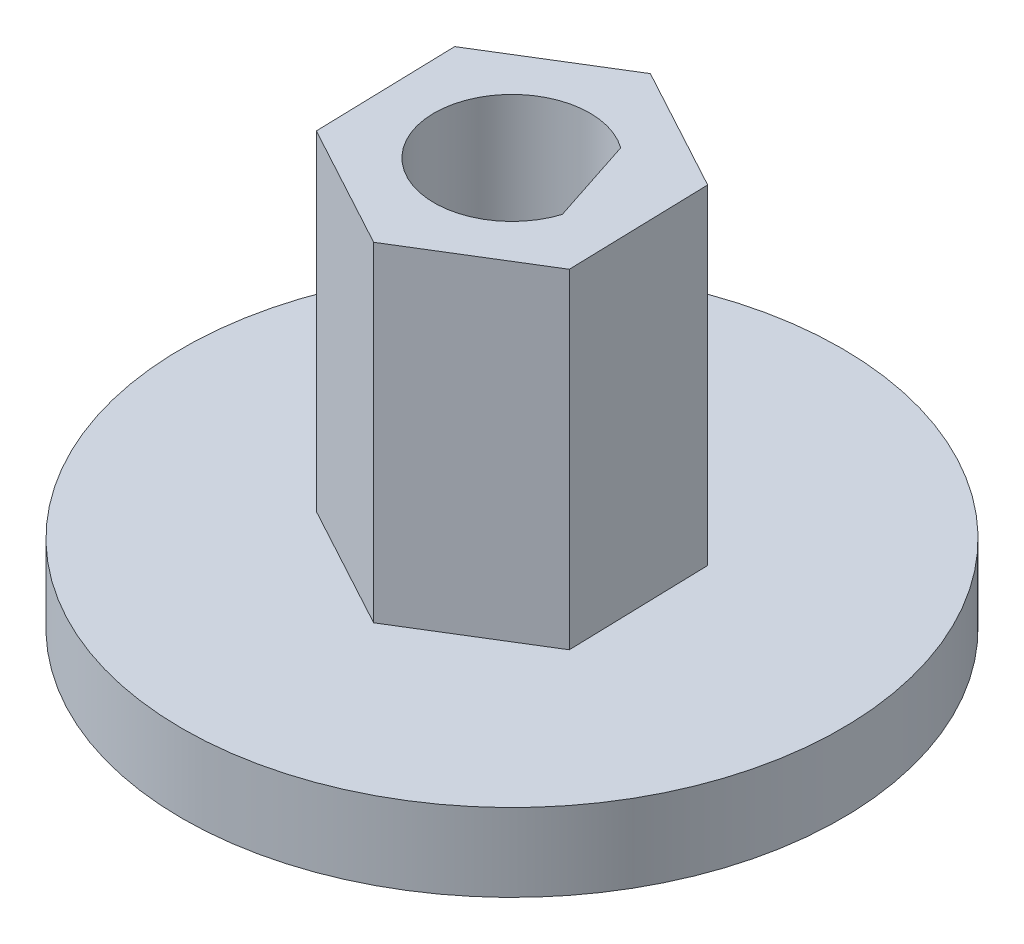
ISO-10303-21;
HEADER;
FILE_DESCRIPTION(('STEP AP214'),'2;1');
FILE_NAME('part.step','',(''),(''),'','','');
FILE_SCHEMA(('AUTOMOTIVE_DESIGN { 1 0 10303 214 1 1 1 1 }'));
ENDSEC;
DATA;
#1=APPLICATION_CONTEXT('core data for automotive mechanical design processes');
#2=APPLICATION_PROTOCOL_DEFINITION('international standard','automotive_design',2000,#1);
#3=PRODUCT_CONTEXT('',#1,'mechanical');
#4=PRODUCT('Part','Part','',(#3));
#5=PRODUCT_RELATED_PRODUCT_CATEGORY('part','',(#4));
#6=PRODUCT_DEFINITION_FORMATION('','',#4);
#7=PRODUCT_DEFINITION_CONTEXT('part definition',#1,'design');
#8=PRODUCT_DEFINITION('design','',#6,#7);
#9=PRODUCT_DEFINITION_SHAPE('','',#8);
#10=(LENGTH_UNIT() NAMED_UNIT(*) SI_UNIT(.MILLI.,.METRE.));
#11=(NAMED_UNIT(*) PLANE_ANGLE_UNIT() SI_UNIT($,.RADIAN.));
#12=(NAMED_UNIT(*) SI_UNIT($,.STERADIAN.) SOLID_ANGLE_UNIT());
#13=UNCERTAINTY_MEASURE_WITH_UNIT(LENGTH_MEASURE(1.E-05),#10,'distance_accuracy_value','');
#14=(GEOMETRIC_REPRESENTATION_CONTEXT(3) GLOBAL_UNCERTAINTY_ASSIGNED_CONTEXT((#13)) GLOBAL_UNIT_ASSIGNED_CONTEXT((#10,
#11,#12)) REPRESENTATION_CONTEXT('',''));
#15=CARTESIAN_POINT('',(0.,0.,0.));
#16=DIRECTION('',(0.,0.,1.));
#17=DIRECTION('',(1.,0.,0.));
#18=AXIS2_PLACEMENT_3D('',#15,#16,#17);
#19=CARTESIAN_POINT('',(0.,0.,0.));
#20=DIRECTION('',(0.,1.,0.));
#21=DIRECTION('',(0.,0.,1.));
#22=AXIS2_PLACEMENT_3D('',#19,#20,#21);
#23=PLANE('',#22);
#24=CARTESIAN_POINT('',(0.,0.,0.));
#25=DIRECTION('',(0.,1.,0.));
#26=DIRECTION('',(0.,0.,1.));
#27=AXIS2_PLACEMENT_3D('',#24,#25,#26);
#28=CIRCLE('',#27,12.7);
#29=CARTESIAN_POINT('',(0.,0.,12.7));
#30=VERTEX_POINT('',#29);
#31=EDGE_CURVE('E37',#30,#30,#28,.T.);
#32=ORIENTED_EDGE('',*,*,#31,.F.);
#33=EDGE_LOOP('',(#32));
#34=FACE_BOUND('',#33,.T.);
#35=DIRECTION('',(0.311402298469126,0.,0.950278174277482));
#36=VECTOR('',#35,1.);
#37=CARTESIAN_POINT('',(2.30686637596834,0.,-0.755950742827355));
#38=LINE('',#37,#36);
#39=CARTESIAN_POINT('',(1.75797567842878,0.,-2.43095074282736));
#40=VERTEX_POINT('',#39);
#41=CARTESIAN_POINT('',(2.8557570735079,0.,0.919049257172645));
#42=VERTEX_POINT('',#41);
#43=EDGE_CURVE('E98',#40,#42,#38,.T.);
#44=ORIENTED_EDGE('',*,*,#43,.F.);
#45=CARTESIAN_POINT('',(0.,0.,0.));
#46=DIRECTION('',(0.,1.,0.));
#47=DIRECTION('',(0.,0.,1.));
#48=AXIS2_PLACEMENT_3D('',#45,#46,#47);
#49=CIRCLE('',#48,3.);
#50=EDGE_CURVE('E100',#40,#42,#49,.T.);
#51=ORIENTED_EDGE('',*,*,#50,.T.);
#52=EDGE_LOOP('',(#44,#51));
#53=FACE_BOUND('',#52,.T.);
#54=ADVANCED_FACE('F33',(#34,#53),#23,.F.);
#55=CARTESIAN_POINT('',(0.,15.7,0.));
#56=DIRECTION('',(0.,1.,0.));
#57=DIRECTION('',(0.,0.,1.));
#58=AXIS2_PLACEMENT_3D('',#55,#56,#57);
#59=PLANE('',#58);
#60=DIRECTION('',(0.879285702622515,0.,0.476294712508579));
#61=VECTOR('',#60,1.);
#62=CARTESIAN_POINT('',(-4.67137463720313,15.7,2.86894178717555));
#63=LINE('',#62,#61);
#64=CARTESIAN_POINT('',(-4.67137463720313,15.7,2.86894178717555));
#65=VERTEX_POINT('',#64);
#66=CARTESIAN_POINT('',(0.148889151071191,15.7,5.48));
#67=VERTEX_POINT('',#66);
#68=EDGE_CURVE('E115',#65,#67,#63,.T.);
#69=ORIENTED_EDGE('',*,*,#68,.T.);
#70=DIRECTION('',(0.852126172031893,0.,-0.523336399401258));
#71=VECTOR('',#70,1.);
#72=CARTESIAN_POINT('',(0.148889151071191,15.7,5.48));
#73=LINE('',#72,#71);
#74=CARTESIAN_POINT('',(4.82026378827432,15.7,2.61105821282444));
#75=VERTEX_POINT('',#74);
#76=EDGE_CURVE('E118',#67,#75,#73,.T.);
#77=ORIENTED_EDGE('',*,*,#76,.T.);
#78=DIRECTION('',(-0.0271595305906223,0.,-0.999631111909837));
#79=VECTOR('',#78,1.);
#80=CARTESIAN_POINT('',(4.82026378827432,15.7,2.61105821282444));
#81=LINE('',#80,#79);
#82=CARTESIAN_POINT('',(4.67137463720313,15.7,-2.86894178717556));
#83=VERTEX_POINT('',#82);
#84=EDGE_CURVE('E121',#75,#83,#81,.T.);
#85=ORIENTED_EDGE('',*,*,#84,.T.);
#86=DIRECTION('',(-0.879285702622515,0.,-0.476294712508579));
#87=VECTOR('',#86,1.);
#88=CARTESIAN_POINT('',(4.67137463720313,15.7,-2.86894178717556));
#89=LINE('',#88,#87);
#90=CARTESIAN_POINT('',(-0.148889151071195,15.7,-5.48));
#91=VERTEX_POINT('',#90);
#92=EDGE_CURVE('E123',#83,#91,#89,.T.);
#93=ORIENTED_EDGE('',*,*,#92,.T.);
#94=DIRECTION('',(-0.852126172031893,0.,0.523336399401258));
#95=VECTOR('',#94,1.);
#96=CARTESIAN_POINT('',(-0.148889151071195,15.7,-5.48));
#97=LINE('',#96,#95);
#98=CARTESIAN_POINT('',(-4.82026378827432,15.7,-2.61105821282445));
#99=VERTEX_POINT('',#98);
#100=EDGE_CURVE('E125',#91,#99,#97,.T.);
#101=ORIENTED_EDGE('',*,*,#100,.T.);
#102=DIRECTION('',(0.0271595305906223,0.,0.999631111909837));
#103=VECTOR('',#102,1.);
#104=CARTESIAN_POINT('',(-4.82026378827432,15.7,-2.61105821282445));
#105=LINE('',#104,#103);
#106=EDGE_CURVE('E127',#99,#65,#105,.T.);
#107=ORIENTED_EDGE('',*,*,#106,.T.);
#108=EDGE_LOOP('',(#69,#77,#85,#93,#101,#107));
#109=FACE_BOUND('',#108,.T.);
#110=CARTESIAN_POINT('',(0.,15.7,0.));
#111=DIRECTION('',(0.,1.,0.));
#112=DIRECTION('',(0.,0.,1.));
#113=AXIS2_PLACEMENT_3D('',#110,#111,#112);
#114=CIRCLE('',#113,3.);
#115=CARTESIAN_POINT('',(1.75797567842878,15.7,-2.43095074282736));
#116=VERTEX_POINT('',#115);
#117=CARTESIAN_POINT('',(2.8557570735079,15.7,0.919049257172645));
#118=VERTEX_POINT('',#117);
#119=EDGE_CURVE('E104',#116,#118,#114,.T.);
#120=ORIENTED_EDGE('',*,*,#119,.F.);
#121=DIRECTION('',(0.311402298469126,0.,0.950278174277482));
#122=VECTOR('',#121,1.);
#123=CARTESIAN_POINT('',(2.30686637596834,15.7,-0.755950742827355));
#124=LINE('',#123,#122);
#125=EDGE_CURVE('E55',#116,#118,#124,.T.);
#126=ORIENTED_EDGE('',*,*,#125,.T.);
#127=EDGE_LOOP('',(#120,#126));
#128=FACE_BOUND('',#127,.T.);
#129=ADVANCED_FACE('F108',(#109,#128),#59,.T.);
#130=CARTESIAN_POINT('',(0.,3.,0.));
#131=DIRECTION('',(0.,-1.,0.));
#132=DIRECTION('',(0.,0.,-1.));
#133=AXIS2_PLACEMENT_3D('',#130,#131,#132);
#134=CYLINDRICAL_SURFACE('',#133,12.7);
#135=CARTESIAN_POINT('',(0.,3.,0.));
#136=DIRECTION('',(0.,1.,0.));
#137=DIRECTION('',(0.,0.,1.));
#138=AXIS2_PLACEMENT_3D('',#135,#136,#137);
#139=CIRCLE('',#138,12.7);
#140=CARTESIAN_POINT('',(0.,3.,12.7));
#141=VERTEX_POINT('',#140);
#142=EDGE_CURVE('E11',#141,#141,#139,.T.);
#143=ORIENTED_EDGE('',*,*,#142,.F.);
#144=EDGE_LOOP('',(#143));
#145=FACE_BOUND('',#144,.T.);
#146=ORIENTED_EDGE('',*,*,#31,.T.);
#147=EDGE_LOOP('',(#146));
#148=FACE_BOUND('',#147,.T.);
#149=ADVANCED_FACE('F35',(#145,#148),#134,.T.);
#150=CARTESIAN_POINT('',(0.,3.,0.));
#151=DIRECTION('',(0.,1.,0.));
#152=DIRECTION('',(0.,0.,1.));
#153=AXIS2_PLACEMENT_3D('',#150,#151,#152);
#154=PLANE('',#153);
#155=DIRECTION('',(0.879285702622515,0.,0.476294712508579));
#156=VECTOR('',#155,1.);
#157=CARTESIAN_POINT('',(-4.67137463720313,3.,2.86894178717555));
#158=LINE('',#157,#156);
#159=CARTESIAN_POINT('',(-4.67137463720313,3.,2.86894178717555));
#160=VERTEX_POINT('',#159);
#161=CARTESIAN_POINT('',(0.148889151071191,3.,5.48));
#162=VERTEX_POINT('',#161);
#163=EDGE_CURVE('E114',#160,#162,#158,.T.);
#164=ORIENTED_EDGE('',*,*,#163,.F.);
#165=DIRECTION('',(0.0271595305906223,0.,0.999631111909837));
#166=VECTOR('',#165,1.);
#167=CARTESIAN_POINT('',(-4.82026378827432,3.,-2.61105821282445));
#168=LINE('',#167,#166);
#169=CARTESIAN_POINT('',(-4.82026378827432,3.,-2.61105821282445));
#170=VERTEX_POINT('',#169);
#171=EDGE_CURVE('E119',#170,#160,#168,.T.);
#172=ORIENTED_EDGE('',*,*,#171,.F.);
#173=DIRECTION('',(-0.852126172031893,0.,0.523336399401258));
#174=VECTOR('',#173,1.);
#175=CARTESIAN_POINT('',(-0.148889151071195,3.,-5.48));
#176=LINE('',#175,#174);
#177=CARTESIAN_POINT('',(-0.148889151071195,3.,-5.48));
#178=VERTEX_POINT('',#177);
#179=EDGE_CURVE('E141',#178,#170,#176,.T.);
#180=ORIENTED_EDGE('',*,*,#179,.F.);
#181=DIRECTION('',(-0.879285702622515,0.,-0.476294712508579));
#182=VECTOR('',#181,1.);
#183=CARTESIAN_POINT('',(4.67137463720313,3.,-2.86894178717556));
#184=LINE('',#183,#182);
#185=CARTESIAN_POINT('',(4.67137463720313,3.,-2.86894178717556));
#186=VERTEX_POINT('',#185);
#187=EDGE_CURVE('E138',#186,#178,#184,.T.);
#188=ORIENTED_EDGE('',*,*,#187,.F.);
#189=DIRECTION('',(-0.0271595305906223,0.,-0.999631111909837));
#190=VECTOR('',#189,1.);
#191=CARTESIAN_POINT('',(4.82026378827432,3.,2.61105821282444));
#192=LINE('',#191,#190);
#193=CARTESIAN_POINT('',(4.82026378827432,3.,2.61105821282444));
#194=VERTEX_POINT('',#193);
#195=EDGE_CURVE('E135',#194,#186,#192,.T.);
#196=ORIENTED_EDGE('',*,*,#195,.F.);
#197=DIRECTION('',(0.852126172031893,0.,-0.523336399401258));
#198=VECTOR('',#197,1.);
#199=CARTESIAN_POINT('',(0.148889151071191,3.,5.48));
#200=LINE('',#199,#198);
#201=EDGE_CURVE('E132',#162,#194,#200,.T.);
#202=ORIENTED_EDGE('',*,*,#201,.F.);
#203=EDGE_LOOP('',(#164,#172,#180,#188,#196,#202));
#204=FACE_BOUND('',#203,.T.);
#205=ORIENTED_EDGE('',*,*,#142,.T.);
#206=EDGE_LOOP('',(#205));
#207=FACE_BOUND('',#206,.T.);
#208=ADVANCED_FACE('F176',(#204,#207),#154,.T.);
#209=CARTESIAN_POINT('',(-4.67137463720313,15.7,2.86894178717555));
#210=DIRECTION('',(0.476294712508579,0.,-0.879285702622515));
#211=DIRECTION('',(-0.879285702622515,0.,-0.476294712508579));
#212=AXIS2_PLACEMENT_3D('',#209,#210,#211);
#213=PLANE('',#212);
#214=ORIENTED_EDGE('',*,*,#163,.T.);
#215=DIRECTION('',(0.,-1.,0.));
#216=VECTOR('',#215,1.);
#217=CARTESIAN_POINT('',(0.148889151071191,15.7,5.48));
#218=LINE('',#217,#216);
#219=EDGE_CURVE('E160',#67,#162,#218,.T.);
#220=ORIENTED_EDGE('',*,*,#219,.F.);
#221=ORIENTED_EDGE('',*,*,#68,.F.);
#222=DIRECTION('',(0.,-1.,0.));
#223=VECTOR('',#222,1.);
#224=CARTESIAN_POINT('',(-4.67137463720313,15.7,2.86894178717555));
#225=LINE('',#224,#223);
#226=EDGE_CURVE('E129',#65,#160,#225,.T.);
#227=ORIENTED_EDGE('',*,*,#226,.T.);
#228=EDGE_LOOP('',(#214,#220,#221,#227));
#229=FACE_BOUND('',#228,.T.);
#230=ADVANCED_FACE('F179',(#229),#213,.F.);
#231=CARTESIAN_POINT('',(0.148889151071191,15.7,5.48));
#232=DIRECTION('',(-0.523336399401258,0.,-0.852126172031893));
#233=DIRECTION('',(-0.852126172031893,0.,0.523336399401258));
#234=AXIS2_PLACEMENT_3D('',#231,#232,#233);
#235=PLANE('',#234);
#236=ORIENTED_EDGE('',*,*,#201,.T.);
#237=DIRECTION('',(0.,-1.,0.));
#238=VECTOR('',#237,1.);
#239=CARTESIAN_POINT('',(4.82026378827432,15.7,2.61105821282444));
#240=LINE('',#239,#238);
#241=EDGE_CURVE('E157',#75,#194,#240,.T.);
#242=ORIENTED_EDGE('',*,*,#241,.F.);
#243=ORIENTED_EDGE('',*,*,#76,.F.);
#244=ORIENTED_EDGE('',*,*,#219,.T.);
#245=EDGE_LOOP('',(#236,#242,#243,#244));
#246=FACE_BOUND('',#245,.T.);
#247=ADVANCED_FACE('F183',(#246),#235,.F.);
#248=CARTESIAN_POINT('',(4.82026378827432,15.7,2.61105821282444));
#249=DIRECTION('',(-0.999631111909837,0.,0.0271595305906223));
#250=DIRECTION('',(0.0271595305906223,0.,0.999631111909837));
#251=AXIS2_PLACEMENT_3D('',#248,#249,#250);
#252=PLANE('',#251);
#253=ORIENTED_EDGE('',*,*,#195,.T.);
#254=DIRECTION('',(0.,-1.,0.));
#255=VECTOR('',#254,1.);
#256=CARTESIAN_POINT('',(4.67137463720313,15.7,-2.86894178717556));
#257=LINE('',#256,#255);
#258=EDGE_CURVE('E154',#83,#186,#257,.T.);
#259=ORIENTED_EDGE('',*,*,#258,.F.);
#260=ORIENTED_EDGE('',*,*,#84,.F.);
#261=ORIENTED_EDGE('',*,*,#241,.T.);
#262=EDGE_LOOP('',(#253,#259,#260,#261));
#263=FACE_BOUND('',#262,.T.);
#264=ADVANCED_FACE('F187',(#263),#252,.F.);
#265=CARTESIAN_POINT('',(4.67137463720313,15.7,-2.86894178717556));
#266=DIRECTION('',(-0.476294712508579,0.,0.879285702622515));
#267=DIRECTION('',(0.879285702622515,0.,0.476294712508579));
#268=AXIS2_PLACEMENT_3D('',#265,#266,#267);
#269=PLANE('',#268);
#270=ORIENTED_EDGE('',*,*,#187,.T.);
#271=DIRECTION('',(0.,-1.,0.));
#272=VECTOR('',#271,1.);
#273=CARTESIAN_POINT('',(-0.148889151071195,15.7,-5.48));
#274=LINE('',#273,#272);
#275=EDGE_CURVE('E151',#91,#178,#274,.T.);
#276=ORIENTED_EDGE('',*,*,#275,.F.);
#277=ORIENTED_EDGE('',*,*,#92,.F.);
#278=ORIENTED_EDGE('',*,*,#258,.T.);
#279=EDGE_LOOP('',(#270,#276,#277,#278));
#280=FACE_BOUND('',#279,.T.);
#281=ADVANCED_FACE('F190',(#280),#269,.F.);
#282=CARTESIAN_POINT('',(-0.148889151071195,15.7,-5.48));
#283=DIRECTION('',(0.523336399401258,0.,0.852126172031893));
#284=DIRECTION('',(0.852126172031893,0.,-0.523336399401258));
#285=AXIS2_PLACEMENT_3D('',#282,#283,#284);
#286=PLANE('',#285);
#287=ORIENTED_EDGE('',*,*,#179,.T.);
#288=DIRECTION('',(0.,-1.,0.));
#289=VECTOR('',#288,1.);
#290=CARTESIAN_POINT('',(-4.82026378827432,15.7,-2.61105821282445));
#291=LINE('',#290,#289);
#292=EDGE_CURVE('E148',#99,#170,#291,.T.);
#293=ORIENTED_EDGE('',*,*,#292,.F.);
#294=ORIENTED_EDGE('',*,*,#100,.F.);
#295=ORIENTED_EDGE('',*,*,#275,.T.);
#296=EDGE_LOOP('',(#287,#293,#294,#295));
#297=FACE_BOUND('',#296,.T.);
#298=ADVANCED_FACE('F194',(#297),#286,.F.);
#299=CARTESIAN_POINT('',(-4.82026378827432,15.7,-2.61105821282445));
#300=DIRECTION('',(0.999631111909837,0.,-0.0271595305906223));
#301=DIRECTION('',(-0.0271595305906223,0.,-0.999631111909837));
#302=AXIS2_PLACEMENT_3D('',#299,#300,#301);
#303=PLANE('',#302);
#304=ORIENTED_EDGE('',*,*,#171,.T.);
#305=ORIENTED_EDGE('',*,*,#226,.F.);
#306=ORIENTED_EDGE('',*,*,#106,.F.);
#307=ORIENTED_EDGE('',*,*,#292,.T.);
#308=EDGE_LOOP('',(#304,#305,#306,#307));
#309=FACE_BOUND('',#308,.T.);
#310=ADVANCED_FACE('F198',(#309),#303,.F.);
#311=CARTESIAN_POINT('',(2.30686637596834,-7.3,-0.755950742827355));
#312=DIRECTION('',(-0.950278174277482,0.,0.311402298469126));
#313=DIRECTION('',(0.311402298469126,0.,0.950278174277482));
#314=AXIS2_PLACEMENT_3D('',#311,#312,#313);
#315=PLANE('',#314);
#316=ORIENTED_EDGE('',*,*,#43,.T.);
#317=DIRECTION('',(0.,1.,0.));
#318=VECTOR('',#317,1.);
#319=CARTESIAN_POINT('',(2.8557570735079,-7.3,0.919049257172645));
#320=LINE('',#319,#318);
#321=EDGE_CURVE('E48',#42,#118,#320,.T.);
#322=ORIENTED_EDGE('',*,*,#321,.T.);
#323=ORIENTED_EDGE('',*,*,#125,.F.);
#324=DIRECTION('',(0.,1.,0.));
#325=VECTOR('',#324,1.);
#326=CARTESIAN_POINT('',(1.75797567842878,-7.3,-2.43095074282736));
#327=LINE('',#326,#325);
#328=EDGE_CURVE('E101',#40,#116,#327,.T.);
#329=ORIENTED_EDGE('',*,*,#328,.F.);
#330=EDGE_LOOP('',(#316,#322,#323,#329));
#331=FACE_BOUND('',#330,.T.);
#332=ADVANCED_FACE('F96',(#331),#315,.T.);
#333=CARTESIAN_POINT('',(0.,-7.3,0.));
#334=DIRECTION('',(0.,1.,0.));
#335=DIRECTION('',(0.,0.,1.));
#336=AXIS2_PLACEMENT_3D('',#333,#334,#335);
#337=CYLINDRICAL_SURFACE('',#336,3.);
#338=ORIENTED_EDGE('',*,*,#328,.T.);
#339=ORIENTED_EDGE('',*,*,#119,.T.);
#340=ORIENTED_EDGE('',*,*,#321,.F.);
#341=ORIENTED_EDGE('',*,*,#50,.F.);
#342=EDGE_LOOP('',(#338,#339,#340,#341));
#343=FACE_BOUND('',#342,.T.);
#344=ADVANCED_FACE('F105',(#343),#337,.F.);
#345=CLOSED_SHELL('',(#54,#129,#149,#208,#230,#247,#264,#281,#298,#310,#332,#344));
#346=MANIFOLD_SOLID_BREP('B2',#345);
#347=ADVANCED_BREP_SHAPE_REPRESENTATION('',(#18,#346),#14);
#348=SHAPE_DEFINITION_REPRESENTATION(#9,#347);
ENDSEC;
END-ISO-10303-21;
